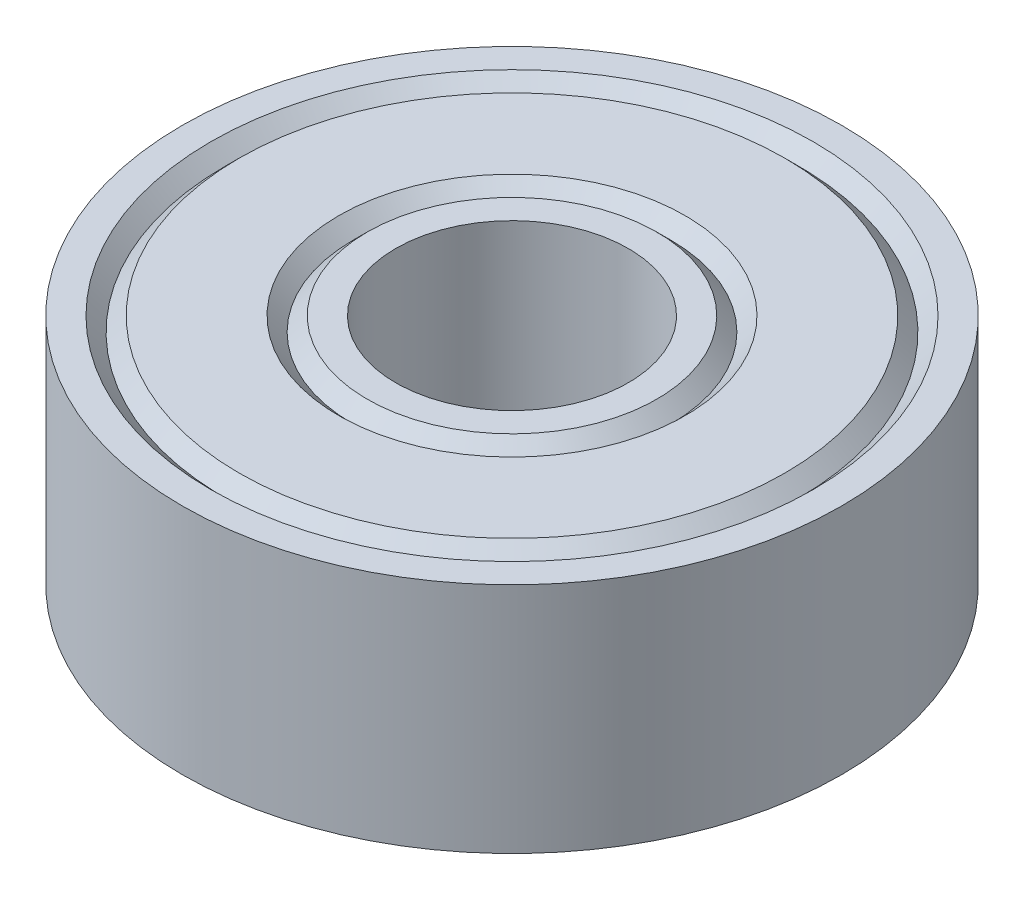
ISO-10303-21;
HEADER;
FILE_DESCRIPTION(('STEP AP214'),'2;1');
FILE_NAME('part.step','',(''),(''),'','','');
FILE_SCHEMA(('AUTOMOTIVE_DESIGN { 1 0 10303 214 1 1 1 1 }'));
ENDSEC;
DATA;
#1=APPLICATION_CONTEXT('core data for automotive mechanical design processes');
#2=APPLICATION_PROTOCOL_DEFINITION('international standard','automotive_design',2000,#1);
#3=PRODUCT_CONTEXT('',#1,'mechanical');
#4=PRODUCT('Part','Part','',(#3));
#5=PRODUCT_RELATED_PRODUCT_CATEGORY('part','',(#4));
#6=PRODUCT_DEFINITION_FORMATION('','',#4);
#7=PRODUCT_DEFINITION_CONTEXT('part definition',#1,'design');
#8=PRODUCT_DEFINITION('design','',#6,#7);
#9=PRODUCT_DEFINITION_SHAPE('','',#8);
#10=(LENGTH_UNIT() NAMED_UNIT(*) SI_UNIT(.MILLI.,.METRE.));
#11=(NAMED_UNIT(*) PLANE_ANGLE_UNIT() SI_UNIT($,.RADIAN.));
#12=(NAMED_UNIT(*) SI_UNIT($,.STERADIAN.) SOLID_ANGLE_UNIT());
#13=UNCERTAINTY_MEASURE_WITH_UNIT(LENGTH_MEASURE(1.E-05),#10,'distance_accuracy_value','');
#14=(GEOMETRIC_REPRESENTATION_CONTEXT(3) GLOBAL_UNCERTAINTY_ASSIGNED_CONTEXT((#13)) GLOBAL_UNIT_ASSIGNED_CONTEXT((#10,
#11,#12)) REPRESENTATION_CONTEXT('',''));
#15=CARTESIAN_POINT('',(0.,0.,0.));
#16=DIRECTION('',(0.,0.,1.));
#17=DIRECTION('',(1.,0.,0.));
#18=AXIS2_PLACEMENT_3D('',#15,#16,#17);
#19=CARTESIAN_POINT('',(0.,3.,0.));
#20=DIRECTION('',(0.,1.,0.));
#21=DIRECTION('',(-1.,0.,0.));
#22=AXIS2_PLACEMENT_3D('',#19,#20,#21);
#23=CYLINDRICAL_SURFACE('',#22,3.);
#24=CARTESIAN_POINT('',(0.,3.00000000000001,0.));
#25=DIRECTION('',(0.,1.,0.));
#26=DIRECTION('',(-1.,0.,0.));
#27=AXIS2_PLACEMENT_3D('',#24,#25,#26);
#28=CIRCLE('',#27,3.);
#29=CARTESIAN_POINT('',(-3.,3.00000000000001,0.));
#30=VERTEX_POINT('',#29);
#31=EDGE_CURVE('E83',#30,#30,#28,.T.);
#32=ORIENTED_EDGE('',*,*,#31,.T.);
#33=EDGE_LOOP('',(#32));
#34=FACE_BOUND('',#33,.T.);
#35=CARTESIAN_POINT('',(0.,-3.00000000000001,0.));
#36=DIRECTION('',(0.,1.,0.));
#37=DIRECTION('',(-1.,0.,0.));
#38=AXIS2_PLACEMENT_3D('',#35,#36,#37);
#39=CIRCLE('',#38,3.);
#40=CARTESIAN_POINT('',(-3.,-3.00000000000001,0.));
#41=VERTEX_POINT('',#40);
#42=EDGE_CURVE('E10',#41,#41,#39,.T.);
#43=ORIENTED_EDGE('',*,*,#42,.F.);
#44=EDGE_LOOP('',(#43));
#45=FACE_BOUND('',#44,.T.);
#46=ADVANCED_FACE('F31',(#34,#45),#23,.F.);
#47=CARTESIAN_POINT('',(-3.,-3.,0.));
#48=DIRECTION('',(0.,-1.,0.));
#49=DIRECTION('',(1.,0.,0.));
#50=AXIS2_PLACEMENT_3D('',#47,#48,#49);
#51=PLANE('',#50);
#52=ORIENTED_EDGE('',*,*,#42,.T.);
#53=EDGE_LOOP('',(#52));
#54=FACE_BOUND('',#53,.T.);
#55=CARTESIAN_POINT('',(0.,-3.,0.));
#56=DIRECTION('',(0.,1.,0.));
#57=DIRECTION('',(-1.,0.,0.));
#58=AXIS2_PLACEMENT_3D('',#55,#56,#57);
#59=CIRCLE('',#58,3.73333333333334);
#60=CARTESIAN_POINT('',(-3.73333333333334,-3.,0.));
#61=VERTEX_POINT('',#60);
#62=EDGE_CURVE('E37',#61,#61,#59,.T.);
#63=ORIENTED_EDGE('',*,*,#62,.F.);
#64=EDGE_LOOP('',(#63));
#65=FACE_BOUND('',#64,.T.);
#66=ADVANCED_FACE('F101',(#54,#65),#51,.T.);
#67=CARTESIAN_POINT('',(0.,-2.63333333333333,0.));
#68=DIRECTION('',(0.,1.,0.));
#69=DIRECTION('',(-1.,0.,0.));
#70=AXIS2_PLACEMENT_3D('',#67,#68,#69);
#71=CONICAL_SURFACE('',#70,4.10000000000001,0.78539816339745);
#72=ORIENTED_EDGE('',*,*,#62,.T.);
#73=EDGE_LOOP('',(#72));
#74=FACE_BOUND('',#73,.T.);
#75=CARTESIAN_POINT('',(0.,-2.63333333333333,0.));
#76=DIRECTION('',(0.,1.,0.));
#77=DIRECTION('',(-1.,0.,0.));
#78=AXIS2_PLACEMENT_3D('',#75,#76,#77);
#79=CIRCLE('',#78,4.10000000000001);
#80=CARTESIAN_POINT('',(-4.1,-2.63333333333333,0.));
#81=VERTEX_POINT('',#80);
#82=EDGE_CURVE('E41',#81,#81,#79,.T.);
#83=ORIENTED_EDGE('',*,*,#82,.F.);
#84=EDGE_LOOP('',(#83));
#85=FACE_BOUND('',#84,.T.);
#86=ADVANCED_FACE('F105',(#74,#85),#71,.T.);
#87=CARTESIAN_POINT('',(0.,-3.,0.));
#88=DIRECTION('',(0.,-1.,0.));
#89=DIRECTION('',(1.,0.,0.));
#90=AXIS2_PLACEMENT_3D('',#87,#88,#89);
#91=CONICAL_SURFACE('',#90,4.46666666666667,0.785398163397447);
#92=ORIENTED_EDGE('',*,*,#82,.T.);
#93=EDGE_LOOP('',(#92));
#94=FACE_BOUND('',#93,.T.);
#95=CARTESIAN_POINT('',(0.,-3.,0.));
#96=DIRECTION('',(0.,1.,0.));
#97=DIRECTION('',(-1.,0.,0.));
#98=AXIS2_PLACEMENT_3D('',#95,#96,#97);
#99=CIRCLE('',#98,4.46666666666667);
#100=CARTESIAN_POINT('',(-4.46666666666667,-3.,0.));
#101=VERTEX_POINT('',#100);
#102=EDGE_CURVE('E45',#101,#101,#99,.T.);
#103=ORIENTED_EDGE('',*,*,#102,.F.);
#104=EDGE_LOOP('',(#103));
#105=FACE_BOUND('',#104,.T.);
#106=ADVANCED_FACE('F109',(#94,#105),#91,.F.);
#107=CARTESIAN_POINT('',(-4.46666666666667,-3.,0.));
#108=DIRECTION('',(0.,-1.,0.));
#109=DIRECTION('',(1.,0.,0.));
#110=AXIS2_PLACEMENT_3D('',#107,#108,#109);
#111=PLANE('',#110);
#112=ORIENTED_EDGE('',*,*,#102,.T.);
#113=EDGE_LOOP('',(#112));
#114=FACE_BOUND('',#113,.T.);
#115=CARTESIAN_POINT('',(0.,-3.,0.));
#116=DIRECTION('',(0.,1.,0.));
#117=DIRECTION('',(-1.,0.,0.));
#118=AXIS2_PLACEMENT_3D('',#115,#116,#117);
#119=CIRCLE('',#118,7.03333333333334);
#120=CARTESIAN_POINT('',(-7.03333333333333,-3.,0.));
#121=VERTEX_POINT('',#120);
#122=EDGE_CURVE('E50',#121,#121,#119,.T.);
#123=ORIENTED_EDGE('',*,*,#122,.F.);
#124=EDGE_LOOP('',(#123));
#125=FACE_BOUND('',#124,.T.);
#126=ADVANCED_FACE('F115',(#114,#125),#111,.T.);
#127=CARTESIAN_POINT('',(0.,-2.63333333333333,0.));
#128=DIRECTION('',(0.,1.,0.));
#129=DIRECTION('',(-1.,0.,0.));
#130=AXIS2_PLACEMENT_3D('',#127,#128,#129);
#131=CONICAL_SURFACE('',#130,7.4,0.785398163397444);
#132=ORIENTED_EDGE('',*,*,#122,.T.);
#133=EDGE_LOOP('',(#132));
#134=FACE_BOUND('',#133,.T.);
#135=CARTESIAN_POINT('',(0.,-2.63333333333333,0.));
#136=DIRECTION('',(0.,1.,0.));
#137=DIRECTION('',(-1.,0.,0.));
#138=AXIS2_PLACEMENT_3D('',#135,#136,#137);
#139=CIRCLE('',#138,7.4);
#140=CARTESIAN_POINT('',(-7.4,-2.63333333333333,0.));
#141=VERTEX_POINT('',#140);
#142=EDGE_CURVE('E53',#141,#141,#139,.T.);
#143=ORIENTED_EDGE('',*,*,#142,.F.);
#144=EDGE_LOOP('',(#143));
#145=FACE_BOUND('',#144,.T.);
#146=ADVANCED_FACE('F119',(#134,#145),#131,.T.);
#147=CARTESIAN_POINT('',(0.,-3.,0.));
#148=DIRECTION('',(0.,-1.,0.));
#149=DIRECTION('',(1.,0.,0.));
#150=AXIS2_PLACEMENT_3D('',#147,#148,#149);
#151=CONICAL_SURFACE('',#150,7.76666666666667,0.785398163397446);
#152=ORIENTED_EDGE('',*,*,#142,.T.);
#153=EDGE_LOOP('',(#152));
#154=FACE_BOUND('',#153,.T.);
#155=CARTESIAN_POINT('',(0.,-3.,0.));
#156=DIRECTION('',(0.,1.,0.));
#157=DIRECTION('',(-1.,0.,0.));
#158=AXIS2_PLACEMENT_3D('',#155,#156,#157);
#159=CIRCLE('',#158,7.76666666666667);
#160=CARTESIAN_POINT('',(-7.76666666666667,-3.,0.));
#161=VERTEX_POINT('',#160);
#162=EDGE_CURVE('E56',#161,#161,#159,.T.);
#163=ORIENTED_EDGE('',*,*,#162,.F.);
#164=EDGE_LOOP('',(#163));
#165=FACE_BOUND('',#164,.T.);
#166=ADVANCED_FACE('F123',(#154,#165),#151,.F.);
#167=CARTESIAN_POINT('',(-7.76666666666667,-3.,0.));
#168=DIRECTION('',(0.,-1.,0.));
#169=DIRECTION('',(1.,0.,0.));
#170=AXIS2_PLACEMENT_3D('',#167,#168,#169);
#171=PLANE('',#170);
#172=ORIENTED_EDGE('',*,*,#162,.T.);
#173=EDGE_LOOP('',(#172));
#174=FACE_BOUND('',#173,.T.);
#175=CARTESIAN_POINT('',(0.,-3.,0.));
#176=DIRECTION('',(0.,1.,0.));
#177=DIRECTION('',(-1.,0.,0.));
#178=AXIS2_PLACEMENT_3D('',#175,#176,#177);
#179=CIRCLE('',#178,8.5);
#180=CARTESIAN_POINT('',(-8.5,-3.,0.));
#181=VERTEX_POINT('',#180);
#182=EDGE_CURVE('E59',#181,#181,#179,.T.);
#183=ORIENTED_EDGE('',*,*,#182,.F.);
#184=EDGE_LOOP('',(#183));
#185=FACE_BOUND('',#184,.T.);
#186=ADVANCED_FACE('F127',(#174,#185),#171,.T.);
#187=CARTESIAN_POINT('',(0.,3.,0.));
#188=DIRECTION('',(0.,1.,0.));
#189=DIRECTION('',(-1.,0.,0.));
#190=AXIS2_PLACEMENT_3D('',#187,#188,#189);
#191=CYLINDRICAL_SURFACE('',#190,8.5);
#192=ORIENTED_EDGE('',*,*,#182,.T.);
#193=EDGE_LOOP('',(#192));
#194=FACE_BOUND('',#193,.T.);
#195=CARTESIAN_POINT('',(0.,3.,0.));
#196=DIRECTION('',(0.,1.,0.));
#197=DIRECTION('',(-1.,0.,0.));
#198=AXIS2_PLACEMENT_3D('',#195,#196,#197);
#199=CIRCLE('',#198,8.50000000000001);
#200=CARTESIAN_POINT('',(-8.50000000000001,3.,0.));
#201=VERTEX_POINT('',#200);
#202=EDGE_CURVE('E62',#201,#201,#199,.T.);
#203=ORIENTED_EDGE('',*,*,#202,.F.);
#204=EDGE_LOOP('',(#203));
#205=FACE_BOUND('',#204,.T.);
#206=ADVANCED_FACE('F131',(#194,#205),#191,.T.);
#207=CARTESIAN_POINT('',(-7.76666666666667,3.,0.));
#208=DIRECTION('',(0.,1.,0.));
#209=DIRECTION('',(-1.,0.,0.));
#210=AXIS2_PLACEMENT_3D('',#207,#208,#209);
#211=PLANE('',#210);
#212=ORIENTED_EDGE('',*,*,#202,.T.);
#213=EDGE_LOOP('',(#212));
#214=FACE_BOUND('',#213,.T.);
#215=CARTESIAN_POINT('',(0.,3.,0.));
#216=DIRECTION('',(0.,1.,0.));
#217=DIRECTION('',(-1.,0.,0.));
#218=AXIS2_PLACEMENT_3D('',#215,#216,#217);
#219=CIRCLE('',#218,7.76666666666667);
#220=CARTESIAN_POINT('',(-7.76666666666667,3.,0.));
#221=VERTEX_POINT('',#220);
#222=EDGE_CURVE('E65',#221,#221,#219,.T.);
#223=ORIENTED_EDGE('',*,*,#222,.F.);
#224=EDGE_LOOP('',(#223));
#225=FACE_BOUND('',#224,.T.);
#226=ADVANCED_FACE('F135',(#214,#225),#211,.T.);
#227=CARTESIAN_POINT('',(0.,2.63333333333333,0.));
#228=DIRECTION('',(0.,1.,0.));
#229=DIRECTION('',(-1.,0.,0.));
#230=AXIS2_PLACEMENT_3D('',#227,#228,#229);
#231=CONICAL_SURFACE('',#230,7.40000000000001,0.785398163397444);
#232=ORIENTED_EDGE('',*,*,#222,.T.);
#233=EDGE_LOOP('',(#232));
#234=FACE_BOUND('',#233,.T.);
#235=CARTESIAN_POINT('',(0.,2.63333333333333,0.));
#236=DIRECTION('',(0.,1.,0.));
#237=DIRECTION('',(-1.,0.,0.));
#238=AXIS2_PLACEMENT_3D('',#235,#236,#237);
#239=CIRCLE('',#238,7.40000000000001);
#240=CARTESIAN_POINT('',(-7.4,2.63333333333333,0.));
#241=VERTEX_POINT('',#240);
#242=EDGE_CURVE('E68',#241,#241,#239,.T.);
#243=ORIENTED_EDGE('',*,*,#242,.F.);
#244=EDGE_LOOP('',(#243));
#245=FACE_BOUND('',#244,.T.);
#246=ADVANCED_FACE('F139',(#234,#245),#231,.F.);
#247=CARTESIAN_POINT('',(0.,3.,0.));
#248=DIRECTION('',(0.,-1.,0.));
#249=DIRECTION('',(1.,0.,0.));
#250=AXIS2_PLACEMENT_3D('',#247,#248,#249);
#251=CONICAL_SURFACE('',#250,7.03333333333334,0.785398163397447);
#252=ORIENTED_EDGE('',*,*,#242,.T.);
#253=EDGE_LOOP('',(#252));
#254=FACE_BOUND('',#253,.T.);
#255=CARTESIAN_POINT('',(0.,3.,0.));
#256=DIRECTION('',(0.,1.,0.));
#257=DIRECTION('',(-1.,0.,0.));
#258=AXIS2_PLACEMENT_3D('',#255,#256,#257);
#259=CIRCLE('',#258,7.03333333333334);
#260=CARTESIAN_POINT('',(-7.03333333333333,3.,0.));
#261=VERTEX_POINT('',#260);
#262=EDGE_CURVE('E71',#261,#261,#259,.T.);
#263=ORIENTED_EDGE('',*,*,#262,.F.);
#264=EDGE_LOOP('',(#263));
#265=FACE_BOUND('',#264,.T.);
#266=ADVANCED_FACE('F143',(#254,#265),#251,.T.);
#267=CARTESIAN_POINT('',(-4.46666666666667,3.,0.));
#268=DIRECTION('',(0.,1.,0.));
#269=DIRECTION('',(-1.,0.,0.));
#270=AXIS2_PLACEMENT_3D('',#267,#268,#269);
#271=PLANE('',#270);
#272=ORIENTED_EDGE('',*,*,#262,.T.);
#273=EDGE_LOOP('',(#272));
#274=FACE_BOUND('',#273,.T.);
#275=CARTESIAN_POINT('',(0.,3.,0.));
#276=DIRECTION('',(0.,1.,0.));
#277=DIRECTION('',(-1.,0.,0.));
#278=AXIS2_PLACEMENT_3D('',#275,#276,#277);
#279=CIRCLE('',#278,4.46666666666668);
#280=CARTESIAN_POINT('',(-4.46666666666667,3.,0.));
#281=VERTEX_POINT('',#280);
#282=EDGE_CURVE('E74',#281,#281,#279,.T.);
#283=ORIENTED_EDGE('',*,*,#282,.F.);
#284=EDGE_LOOP('',(#283));
#285=FACE_BOUND('',#284,.T.);
#286=ADVANCED_FACE('F147',(#274,#285),#271,.T.);
#287=CARTESIAN_POINT('',(0.,2.63333333333333,0.));
#288=DIRECTION('',(0.,1.,0.));
#289=DIRECTION('',(-1.,0.,0.));
#290=AXIS2_PLACEMENT_3D('',#287,#288,#289);
#291=CONICAL_SURFACE('',#290,4.10000000000001,0.785398163397448);
#292=ORIENTED_EDGE('',*,*,#282,.T.);
#293=EDGE_LOOP('',(#292));
#294=FACE_BOUND('',#293,.T.);
#295=CARTESIAN_POINT('',(0.,2.63333333333333,0.));
#296=DIRECTION('',(0.,1.,0.));
#297=DIRECTION('',(-1.,0.,0.));
#298=AXIS2_PLACEMENT_3D('',#295,#296,#297);
#299=CIRCLE('',#298,4.10000000000001);
#300=CARTESIAN_POINT('',(-4.1,2.63333333333333,0.));
#301=VERTEX_POINT('',#300);
#302=EDGE_CURVE('E77',#301,#301,#299,.T.);
#303=ORIENTED_EDGE('',*,*,#302,.F.);
#304=EDGE_LOOP('',(#303));
#305=FACE_BOUND('',#304,.T.);
#306=ADVANCED_FACE('F97',(#294,#305),#291,.F.);
#307=CARTESIAN_POINT('',(0.,3.,0.));
#308=DIRECTION('',(0.,-1.,0.));
#309=DIRECTION('',(1.,0.,0.));
#310=AXIS2_PLACEMENT_3D('',#307,#308,#309);
#311=CONICAL_SURFACE('',#310,3.73333333333334,0.785398163397447);
#312=ORIENTED_EDGE('',*,*,#302,.T.);
#313=EDGE_LOOP('',(#312));
#314=FACE_BOUND('',#313,.T.);
#315=CARTESIAN_POINT('',(0.,3.,0.));
#316=DIRECTION('',(0.,1.,0.));
#317=DIRECTION('',(-1.,0.,0.));
#318=AXIS2_PLACEMENT_3D('',#315,#316,#317);
#319=CIRCLE('',#318,3.73333333333334);
#320=CARTESIAN_POINT('',(-3.73333333333334,3.,0.));
#321=VERTEX_POINT('',#320);
#322=EDGE_CURVE('E80',#321,#321,#319,.T.);
#323=ORIENTED_EDGE('',*,*,#322,.F.);
#324=EDGE_LOOP('',(#323));
#325=FACE_BOUND('',#324,.T.);
#326=ADVANCED_FACE('F91',(#314,#325),#311,.T.);
#327=CARTESIAN_POINT('',(-3.,3.,0.));
#328=DIRECTION('',(0.,1.,0.));
#329=DIRECTION('',(-1.,0.,0.));
#330=AXIS2_PLACEMENT_3D('',#327,#328,#329);
#331=PLANE('',#330);
#332=ORIENTED_EDGE('',*,*,#322,.T.);
#333=EDGE_LOOP('',(#332));
#334=FACE_BOUND('',#333,.T.);
#335=ORIENTED_EDGE('',*,*,#31,.F.);
#336=EDGE_LOOP('',(#335));
#337=FACE_BOUND('',#336,.T.);
#338=ADVANCED_FACE('F89',(#334,#337),#331,.T.);
#339=CLOSED_SHELL('',(#46,#66,#86,#106,#126,#146,#166,#186,#206,#226,#246,#266,#286,#306,#326,#338));
#340=MANIFOLD_SOLID_BREP('B2',#339);
#341=ADVANCED_BREP_SHAPE_REPRESENTATION('',(#18,#340),#14);
#342=SHAPE_DEFINITION_REPRESENTATION(#9,#341);
ENDSEC;
END-ISO-10303-21;
